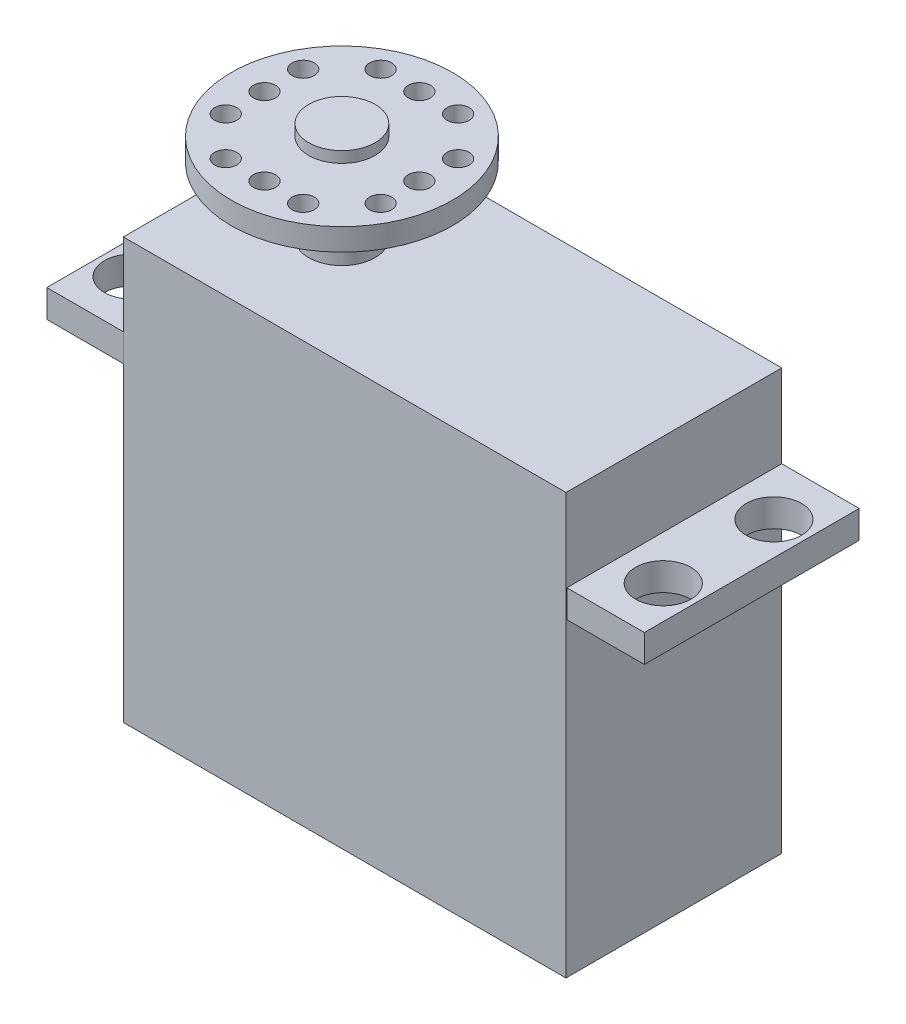
ISO-10303-21;
HEADER;
FILE_DESCRIPTION(('STEP AP214'),'2;1');
FILE_NAME('part.step','',(''),(''),'','','');
FILE_SCHEMA(('AUTOMOTIVE_DESIGN { 1 0 10303 214 1 1 1 1 }'));
ENDSEC;
DATA;
#1=APPLICATION_CONTEXT('core data for automotive mechanical design processes');
#2=APPLICATION_PROTOCOL_DEFINITION('international standard','automotive_design',2000,#1);
#3=PRODUCT_CONTEXT('',#1,'mechanical');
#4=PRODUCT('Part','Part','',(#3));
#5=PRODUCT_RELATED_PRODUCT_CATEGORY('part','',(#4));
#6=PRODUCT_DEFINITION_FORMATION('','',#4);
#7=PRODUCT_DEFINITION_CONTEXT('part definition',#1,'design');
#8=PRODUCT_DEFINITION('design','',#6,#7);
#9=PRODUCT_DEFINITION_SHAPE('','',#8);
#10=(LENGTH_UNIT() NAMED_UNIT(*) SI_UNIT(.MILLI.,.METRE.));
#11=(NAMED_UNIT(*) PLANE_ANGLE_UNIT() SI_UNIT($,.RADIAN.));
#12=(NAMED_UNIT(*) SI_UNIT($,.STERADIAN.) SOLID_ANGLE_UNIT());
#13=UNCERTAINTY_MEASURE_WITH_UNIT(LENGTH_MEASURE(1.E-05),#10,'distance_accuracy_value','');
#14=(GEOMETRIC_REPRESENTATION_CONTEXT(3) GLOBAL_UNCERTAINTY_ASSIGNED_CONTEXT((#13)) GLOBAL_UNIT_ASSIGNED_CONTEXT((#10,
#11,#12)) REPRESENTATION_CONTEXT('',''));
#15=CARTESIAN_POINT('',(0.,0.,0.));
#16=DIRECTION('',(0.,0.,1.));
#17=DIRECTION('',(1.,0.,0.));
#18=AXIS2_PLACEMENT_3D('',#15,#16,#17);
#19=CARTESIAN_POINT('',(0.,0.,19.5));
#20=DIRECTION('',(1.,0.,0.));
#21=DIRECTION('',(0.,0.,-1.));
#22=AXIS2_PLACEMENT_3D('',#19,#20,#21);
#23=PLANE('',#22);
#24=DIRECTION('',(0.,-1.,0.));
#25=VECTOR('',#24,1.);
#26=CARTESIAN_POINT('',(0.,30.5,19.4196359568841));
#27=LINE('',#26,#25);
#28=CARTESIAN_POINT('',(0.,30.5,19.4196359568841));
#29=VERTEX_POINT('',#28);
#30=CARTESIAN_POINT('',(0.,28.,19.4196359568841));
#31=VERTEX_POINT('',#30);
#32=EDGE_CURVE('E154',#29,#31,#27,.T.);
#33=ORIENTED_EDGE('',*,*,#32,.T.);
#34=DIRECTION('',(0.,0.,-1.));
#35=VECTOR('',#34,1.);
#36=CARTESIAN_POINT('',(0.,28.,0.));
#37=LINE('',#36,#35);
#38=CARTESIAN_POINT('',(0.,28.,0.));
#39=VERTEX_POINT('',#38);
#40=EDGE_CURVE('E49',#31,#39,#37,.T.);
#41=ORIENTED_EDGE('',*,*,#40,.T.);
#42=DIRECTION('',(0.,-1.,0.));
#43=VECTOR('',#42,1.);
#44=CARTESIAN_POINT('',(0.,0.,0.));
#45=LINE('',#44,#43);
#46=CARTESIAN_POINT('',(0.,0.,0.));
#47=VERTEX_POINT('',#46);
#48=EDGE_CURVE('E193',#39,#47,#45,.T.);
#49=ORIENTED_EDGE('',*,*,#48,.T.);
#50=DIRECTION('',(0.,0.,-1.));
#51=VECTOR('',#50,1.);
#52=CARTESIAN_POINT('',(0.,0.,19.5));
#53=LINE('',#52,#51);
#54=CARTESIAN_POINT('',(0.,0.,19.5));
#55=VERTEX_POINT('',#54);
#56=EDGE_CURVE('E42',#55,#47,#53,.T.);
#57=ORIENTED_EDGE('',*,*,#56,.F.);
#58=DIRECTION('',(0.,-1.,0.));
#59=VECTOR('',#58,1.);
#60=CARTESIAN_POINT('',(0.,0.,19.5));
#61=LINE('',#60,#59);
#62=CARTESIAN_POINT('',(0.,38.,19.5));
#63=VERTEX_POINT('',#62);
#64=EDGE_CURVE('E194',#63,#55,#61,.T.);
#65=ORIENTED_EDGE('',*,*,#64,.F.);
#66=DIRECTION('',(0.,0.,-1.));
#67=VECTOR('',#66,1.);
#68=CARTESIAN_POINT('',(0.,38.,19.5));
#69=LINE('',#68,#67);
#70=CARTESIAN_POINT('',(0.,38.,0.));
#71=VERTEX_POINT('',#70);
#72=EDGE_CURVE('E204',#63,#71,#69,.T.);
#73=ORIENTED_EDGE('',*,*,#72,.T.);
#74=CARTESIAN_POINT('',(0.,30.5,0.));
#75=VERTEX_POINT('',#74);
#76=EDGE_CURVE('E205',#71,#75,#45,.T.);
#77=ORIENTED_EDGE('',*,*,#76,.T.);
#78=DIRECTION('',(0.,0.,-1.));
#79=VECTOR('',#78,1.);
#80=CARTESIAN_POINT('',(0.,30.5,0.));
#81=LINE('',#80,#79);
#82=EDGE_CURVE('E141',#29,#75,#81,.T.);
#83=ORIENTED_EDGE('',*,*,#82,.F.);
#84=EDGE_LOOP('',(#33,#41,#49,#57,#65,#73,#77,#83));
#85=FACE_BOUND('',#84,.T.);
#86=ADVANCED_FACE('F35',(#85),#23,.F.);
#87=CARTESIAN_POINT('',(0.,0.,19.5));
#88=DIRECTION('',(0.,1.,0.));
#89=DIRECTION('',(0.,0.,1.));
#90=AXIS2_PLACEMENT_3D('',#87,#88,#89);
#91=PLANE('',#90);
#92=DIRECTION('',(1.,0.,0.));
#93=VECTOR('',#92,1.);
#94=CARTESIAN_POINT('',(0.,0.,0.));
#95=LINE('',#94,#93);
#96=CARTESIAN_POINT('',(40.,0.,0.));
#97=VERTEX_POINT('',#96);
#98=EDGE_CURVE('E207',#47,#97,#95,.T.);
#99=ORIENTED_EDGE('',*,*,#98,.T.);
#100=DIRECTION('',(0.,0.,-1.));
#101=VECTOR('',#100,1.);
#102=CARTESIAN_POINT('',(40.,0.,19.5));
#103=LINE('',#102,#101);
#104=CARTESIAN_POINT('',(40.,0.,19.5));
#105=VERTEX_POINT('',#104);
#106=EDGE_CURVE('E218',#105,#97,#103,.T.);
#107=ORIENTED_EDGE('',*,*,#106,.F.);
#108=DIRECTION('',(1.,0.,0.));
#109=VECTOR('',#108,1.);
#110=CARTESIAN_POINT('',(0.,0.,19.5));
#111=LINE('',#110,#109);
#112=EDGE_CURVE('E197',#55,#105,#111,.T.);
#113=ORIENTED_EDGE('',*,*,#112,.F.);
#114=ORIENTED_EDGE('',*,*,#56,.T.);
#115=EDGE_LOOP('',(#99,#107,#113,#114));
#116=FACE_BOUND('',#115,.T.);
#117=ADVANCED_FACE('F223',(#116),#91,.F.);
#118=CARTESIAN_POINT('',(40.,0.,19.5));
#119=DIRECTION('',(-1.,0.,0.));
#120=DIRECTION('',(0.,0.,1.));
#121=AXIS2_PLACEMENT_3D('',#118,#119,#120);
#122=PLANE('',#121);
#123=DIRECTION('',(0.,1.,0.));
#124=VECTOR('',#123,1.);
#125=CARTESIAN_POINT('',(40.,0.,0.));
#126=LINE('',#125,#124);
#127=CARTESIAN_POINT('',(40.,28.,0.));
#128=VERTEX_POINT('',#127);
#129=EDGE_CURVE('E210',#97,#128,#126,.T.);
#130=ORIENTED_EDGE('',*,*,#129,.T.);
#131=DIRECTION('',(0.,0.,1.));
#132=VECTOR('',#131,1.);
#133=CARTESIAN_POINT('',(40.,28.,0.));
#134=LINE('',#133,#132);
#135=CARTESIAN_POINT('',(40.,28.,19.4196359568841));
#136=VERTEX_POINT('',#135);
#137=EDGE_CURVE('E57',#128,#136,#134,.T.);
#138=ORIENTED_EDGE('',*,*,#137,.T.);
#139=DIRECTION('',(0.,-1.,0.));
#140=VECTOR('',#139,1.);
#141=CARTESIAN_POINT('',(40.,30.5,19.4196359568841));
#142=LINE('',#141,#140);
#143=CARTESIAN_POINT('',(40.,30.5,19.4196359568841));
#144=VERTEX_POINT('',#143);
#145=EDGE_CURVE('E190',#144,#136,#142,.T.);
#146=ORIENTED_EDGE('',*,*,#145,.F.);
#147=DIRECTION('',(0.,0.,1.));
#148=VECTOR('',#147,1.);
#149=CARTESIAN_POINT('',(40.,30.5,0.));
#150=LINE('',#149,#148);
#151=CARTESIAN_POINT('',(40.,30.5,0.));
#152=VERTEX_POINT('',#151);
#153=EDGE_CURVE('E166',#152,#144,#150,.T.);
#154=ORIENTED_EDGE('',*,*,#153,.F.);
#155=CARTESIAN_POINT('',(40.,38.,0.));
#156=VERTEX_POINT('',#155);
#157=EDGE_CURVE('E209',#152,#156,#126,.T.);
#158=ORIENTED_EDGE('',*,*,#157,.T.);
#159=DIRECTION('',(0.,0.,-1.));
#160=VECTOR('',#159,1.);
#161=CARTESIAN_POINT('',(40.,38.,19.5));
#162=LINE('',#161,#160);
#163=CARTESIAN_POINT('',(40.,38.,19.5));
#164=VERTEX_POINT('',#163);
#165=EDGE_CURVE('E215',#164,#156,#162,.T.);
#166=ORIENTED_EDGE('',*,*,#165,.F.);
#167=DIRECTION('',(0.,1.,0.));
#168=VECTOR('',#167,1.);
#169=CARTESIAN_POINT('',(40.,0.,19.5));
#170=LINE('',#169,#168);
#171=EDGE_CURVE('E200',#105,#164,#170,.T.);
#172=ORIENTED_EDGE('',*,*,#171,.F.);
#173=ORIENTED_EDGE('',*,*,#106,.T.);
#174=EDGE_LOOP('',(#130,#138,#146,#154,#158,#166,#172,#173));
#175=FACE_BOUND('',#174,.T.);
#176=ADVANCED_FACE('F231',(#175),#122,.F.);
#177=CARTESIAN_POINT('',(0.,38.,19.5));
#178=DIRECTION('',(0.,-1.,0.));
#179=DIRECTION('',(0.,0.,-1.));
#180=AXIS2_PLACEMENT_3D('',#177,#178,#179);
#181=PLANE('',#180);
#182=CARTESIAN_POINT('',(10.,38.,9.75));
#183=DIRECTION('',(0.,-1.,0.));
#184=DIRECTION('',(0.,0.,-1.));
#185=AXIS2_PLACEMENT_3D('',#182,#183,#184);
#186=CIRCLE('',#185,3.);
#187=CARTESIAN_POINT('',(10.,38.,6.75));
#188=VERTEX_POINT('',#187);
#189=EDGE_CURVE('E11',#188,#188,#186,.F.);
#190=ORIENTED_EDGE('',*,*,#189,.F.);
#191=EDGE_LOOP('',(#190));
#192=FACE_BOUND('',#191,.T.);
#193=DIRECTION('',(-1.,0.,0.));
#194=VECTOR('',#193,1.);
#195=CARTESIAN_POINT('',(0.,38.,0.));
#196=LINE('',#195,#194);
#197=EDGE_CURVE('E198',#156,#71,#196,.T.);
#198=ORIENTED_EDGE('',*,*,#197,.T.);
#199=ORIENTED_EDGE('',*,*,#72,.F.);
#200=DIRECTION('',(-1.,0.,0.));
#201=VECTOR('',#200,1.);
#202=CARTESIAN_POINT('',(0.,38.,19.5));
#203=LINE('',#202,#201);
#204=EDGE_CURVE('E202',#164,#63,#203,.T.);
#205=ORIENTED_EDGE('',*,*,#204,.F.);
#206=ORIENTED_EDGE('',*,*,#165,.T.);
#207=EDGE_LOOP('',(#198,#199,#205,#206));
#208=FACE_BOUND('',#207,.T.);
#209=ADVANCED_FACE('F239',(#192,#208),#181,.F.);
#210=CARTESIAN_POINT('',(0.,0.,19.5));
#211=DIRECTION('',(0.,0.,-1.));
#212=DIRECTION('',(-1.,0.,0.));
#213=AXIS2_PLACEMENT_3D('',#210,#211,#212);
#214=PLANE('',#213);
#215=ORIENTED_EDGE('',*,*,#64,.T.);
#216=ORIENTED_EDGE('',*,*,#112,.T.);
#217=ORIENTED_EDGE('',*,*,#171,.T.);
#218=ORIENTED_EDGE('',*,*,#204,.T.);
#219=EDGE_LOOP('',(#215,#216,#217,#218));
#220=FACE_BOUND('',#219,.T.);
#221=ADVANCED_FACE('F236',(#220),#214,.F.);
#222=CARTESIAN_POINT('',(0.,0.,0.));
#223=DIRECTION('',(0.,0.,-1.));
#224=DIRECTION('',(-1.,0.,0.));
#225=AXIS2_PLACEMENT_3D('',#222,#223,#224);
#226=PLANE('',#225);
#227=ORIENTED_EDGE('',*,*,#76,.F.);
#228=ORIENTED_EDGE('',*,*,#197,.F.);
#229=ORIENTED_EDGE('',*,*,#157,.F.);
#230=DIRECTION('',(-1.,0.,0.));
#231=VECTOR('',#230,1.);
#232=CARTESIAN_POINT('',(40.,30.5,0.));
#233=LINE('',#232,#231);
#234=CARTESIAN_POINT('',(47.,30.5,0.));
#235=VERTEX_POINT('',#234);
#236=EDGE_CURVE('E174',#235,#152,#233,.T.);
#237=ORIENTED_EDGE('',*,*,#236,.F.);
#238=DIRECTION('',(0.,-1.,0.));
#239=VECTOR('',#238,1.);
#240=CARTESIAN_POINT('',(47.,30.5,0.));
#241=LINE('',#240,#239);
#242=CARTESIAN_POINT('',(47.,28.,0.));
#243=VERTEX_POINT('',#242);
#244=EDGE_CURVE('E177',#235,#243,#241,.T.);
#245=ORIENTED_EDGE('',*,*,#244,.T.);
#246=DIRECTION('',(-1.,0.,0.));
#247=VECTOR('',#246,1.);
#248=CARTESIAN_POINT('',(40.,28.,0.));
#249=LINE('',#248,#247);
#250=EDGE_CURVE('E170',#243,#128,#249,.T.);
#251=ORIENTED_EDGE('',*,*,#250,.T.);
#252=ORIENTED_EDGE('',*,*,#129,.F.);
#253=ORIENTED_EDGE('',*,*,#98,.F.);
#254=ORIENTED_EDGE('',*,*,#48,.F.);
#255=DIRECTION('',(-1.,0.,0.));
#256=VECTOR('',#255,1.);
#257=CARTESIAN_POINT('',(0.,28.,0.));
#258=LINE('',#257,#256);
#259=CARTESIAN_POINT('',(-7.,28.,0.));
#260=VERTEX_POINT('',#259);
#261=EDGE_CURVE('E148',#39,#260,#258,.T.);
#262=ORIENTED_EDGE('',*,*,#261,.T.);
#263=DIRECTION('',(0.,-1.,0.));
#264=VECTOR('',#263,1.);
#265=CARTESIAN_POINT('',(-7.,30.5,0.));
#266=LINE('',#265,#264);
#267=CARTESIAN_POINT('',(-7.,30.5,0.));
#268=VERTEX_POINT('',#267);
#269=EDGE_CURVE('E128',#268,#260,#266,.T.);
#270=ORIENTED_EDGE('',*,*,#269,.F.);
#271=DIRECTION('',(-1.,0.,0.));
#272=VECTOR('',#271,1.);
#273=CARTESIAN_POINT('',(0.,30.5,0.));
#274=LINE('',#273,#272);
#275=EDGE_CURVE('E135',#75,#268,#274,.T.);
#276=ORIENTED_EDGE('',*,*,#275,.F.);
#277=EDGE_LOOP('',(#227,#228,#229,#237,#245,#251,#252,#253,#254,#262,#270,#276));
#278=FACE_BOUND('',#277,.T.);
#279=ADVANCED_FACE('F146',(#278),#226,.T.);
#280=CARTESIAN_POINT('',(0.,30.5,0.));
#281=DIRECTION('',(0.,1.,0.));
#282=DIRECTION('',(0.,0.,1.));
#283=AXIS2_PLACEMENT_3D('',#280,#281,#282);
#284=PLANE('',#283);
#285=CARTESIAN_POINT('',(44.,30.5,4.70981797844207));
#286=DIRECTION('',(0.,1.,0.));
#287=DIRECTION('',(0.,0.,1.));
#288=AXIS2_PLACEMENT_3D('',#285,#286,#287);
#289=CIRCLE('',#288,2.5);
#290=CARTESIAN_POINT('',(44.,30.5,7.20981797844208));
#291=VERTEX_POINT('',#290);
#292=EDGE_CURVE('E161',#291,#291,#289,.T.);
#293=ORIENTED_EDGE('',*,*,#292,.F.);
#294=EDGE_LOOP('',(#293));
#295=FACE_BOUND('',#294,.T.);
#296=ORIENTED_EDGE('',*,*,#153,.T.);
#297=DIRECTION('',(1.,0.,0.));
#298=VECTOR('',#297,1.);
#299=CARTESIAN_POINT('',(40.,30.5,19.4196359568841));
#300=LINE('',#299,#298);
#301=CARTESIAN_POINT('',(47.,30.5,19.4196359568841));
#302=VERTEX_POINT('',#301);
#303=EDGE_CURVE('E169',#144,#302,#300,.T.);
#304=ORIENTED_EDGE('',*,*,#303,.T.);
#305=DIRECTION('',(0.,0.,-1.));
#306=VECTOR('',#305,1.);
#307=CARTESIAN_POINT('',(47.,30.5,0.));
#308=LINE('',#307,#306);
#309=EDGE_CURVE('E172',#302,#235,#308,.T.);
#310=ORIENTED_EDGE('',*,*,#309,.T.);
#311=ORIENTED_EDGE('',*,*,#236,.T.);
#312=EDGE_LOOP('',(#296,#304,#310,#311));
#313=FACE_BOUND('',#312,.T.);
#314=CARTESIAN_POINT('',(44.,30.5,14.7098179784421));
#315=DIRECTION('',(0.,1.,0.));
#316=DIRECTION('',(0.,0.,-1.));
#317=AXIS2_PLACEMENT_3D('',#314,#315,#316);
#318=CIRCLE('',#317,2.5);
#319=CARTESIAN_POINT('',(44.,30.5,12.2098179784421));
#320=VERTEX_POINT('',#319);
#321=EDGE_CURVE('E152',#320,#320,#318,.T.);
#322=ORIENTED_EDGE('',*,*,#321,.F.);
#323=EDGE_LOOP('',(#322));
#324=FACE_BOUND('',#323,.T.);
#325=ADVANCED_FACE('F244',(#295,#313,#324),#284,.T.);
#326=CARTESIAN_POINT('',(0.,28.,0.));
#327=DIRECTION('',(0.,1.,0.));
#328=DIRECTION('',(0.,0.,1.));
#329=AXIS2_PLACEMENT_3D('',#326,#327,#328);
#330=PLANE('',#329);
#331=ORIENTED_EDGE('',*,*,#137,.F.);
#332=ORIENTED_EDGE('',*,*,#250,.F.);
#333=DIRECTION('',(0.,0.,-1.));
#334=VECTOR('',#333,1.);
#335=CARTESIAN_POINT('',(47.,28.,0.));
#336=LINE('',#335,#334);
#337=CARTESIAN_POINT('',(47.,28.,19.4196359568841));
#338=VERTEX_POINT('',#337);
#339=EDGE_CURVE('E181',#338,#243,#336,.T.);
#340=ORIENTED_EDGE('',*,*,#339,.F.);
#341=DIRECTION('',(1.,0.,0.));
#342=VECTOR('',#341,1.);
#343=CARTESIAN_POINT('',(40.,28.,19.4196359568841));
#344=LINE('',#343,#342);
#345=EDGE_CURVE('E179',#136,#338,#344,.T.);
#346=ORIENTED_EDGE('',*,*,#345,.F.);
#347=EDGE_LOOP('',(#331,#332,#340,#346));
#348=FACE_BOUND('',#347,.T.);
#349=CARTESIAN_POINT('',(44.,28.,4.70981797844207));
#350=DIRECTION('',(0.,1.,0.));
#351=DIRECTION('',(0.,0.,1.));
#352=AXIS2_PLACEMENT_3D('',#349,#350,#351);
#353=CIRCLE('',#352,2.5);
#354=CARTESIAN_POINT('',(44.,28.,7.20981797844208));
#355=VERTEX_POINT('',#354);
#356=EDGE_CURVE('E159',#355,#355,#353,.T.);
#357=ORIENTED_EDGE('',*,*,#356,.T.);
#358=EDGE_LOOP('',(#357));
#359=FACE_BOUND('',#358,.T.);
#360=CARTESIAN_POINT('',(44.,28.,14.7098179784421));
#361=DIRECTION('',(0.,1.,0.));
#362=DIRECTION('',(0.,0.,-1.));
#363=AXIS2_PLACEMENT_3D('',#360,#361,#362);
#364=CIRCLE('',#363,2.5);
#365=CARTESIAN_POINT('',(44.,28.,12.2098179784421));
#366=VERTEX_POINT('',#365);
#367=EDGE_CURVE('E149',#366,#366,#364,.T.);
#368=ORIENTED_EDGE('',*,*,#367,.T.);
#369=EDGE_LOOP('',(#368));
#370=FACE_BOUND('',#369,.T.);
#371=ADVANCED_FACE('F254',(#348,#359,#370),#330,.F.);
#372=CARTESIAN_POINT('',(40.,30.5,19.4196359568841));
#373=DIRECTION('',(0.,0.,-1.));
#374=DIRECTION('',(-1.,0.,0.));
#375=AXIS2_PLACEMENT_3D('',#372,#373,#374);
#376=PLANE('',#375);
#377=ORIENTED_EDGE('',*,*,#345,.T.);
#378=DIRECTION('',(0.,-1.,0.));
#379=VECTOR('',#378,1.);
#380=CARTESIAN_POINT('',(47.,30.5,19.4196359568841));
#381=LINE('',#380,#379);
#382=EDGE_CURVE('E187',#302,#338,#381,.T.);
#383=ORIENTED_EDGE('',*,*,#382,.F.);
#384=ORIENTED_EDGE('',*,*,#303,.F.);
#385=ORIENTED_EDGE('',*,*,#145,.T.);
#386=EDGE_LOOP('',(#377,#383,#384,#385));
#387=FACE_BOUND('',#386,.T.);
#388=ADVANCED_FACE('F257',(#387),#376,.F.);
#389=CARTESIAN_POINT('',(47.,30.5,0.));
#390=DIRECTION('',(-1.,0.,0.));
#391=DIRECTION('',(0.,0.,1.));
#392=AXIS2_PLACEMENT_3D('',#389,#390,#391);
#393=PLANE('',#392);
#394=ORIENTED_EDGE('',*,*,#339,.T.);
#395=ORIENTED_EDGE('',*,*,#244,.F.);
#396=ORIENTED_EDGE('',*,*,#309,.F.);
#397=ORIENTED_EDGE('',*,*,#382,.T.);
#398=EDGE_LOOP('',(#394,#395,#396,#397));
#399=FACE_BOUND('',#398,.T.);
#400=ADVANCED_FACE('F251',(#399),#393,.F.);
#401=CARTESIAN_POINT('',(44.,30.5,4.70981797844207));
#402=DIRECTION('',(0.,-1.,0.));
#403=DIRECTION('',(0.,0.,-1.));
#404=AXIS2_PLACEMENT_3D('',#401,#402,#403);
#405=CYLINDRICAL_SURFACE('',#404,2.5);
#406=ORIENTED_EDGE('',*,*,#292,.T.);
#407=EDGE_LOOP('',(#406));
#408=FACE_BOUND('',#407,.T.);
#409=ORIENTED_EDGE('',*,*,#356,.F.);
#410=EDGE_LOOP('',(#409));
#411=FACE_BOUND('',#410,.T.);
#412=ADVANCED_FACE('F264',(#408,#411),#405,.F.);
#413=CARTESIAN_POINT('',(44.,30.5,14.7098179784421));
#414=DIRECTION('',(0.,-1.,0.));
#415=DIRECTION('',(0.,0.,-1.));
#416=AXIS2_PLACEMENT_3D('',#413,#414,#415);
#417=CYLINDRICAL_SURFACE('',#416,2.5);
#418=ORIENTED_EDGE('',*,*,#321,.T.);
#419=EDGE_LOOP('',(#418));
#420=FACE_BOUND('',#419,.T.);
#421=ORIENTED_EDGE('',*,*,#367,.F.);
#422=EDGE_LOOP('',(#421));
#423=FACE_BOUND('',#422,.T.);
#424=ADVANCED_FACE('F321',(#420,#423),#417,.F.);
#425=CARTESIAN_POINT('',(0.,30.5,0.));
#426=DIRECTION('',(0.,1.,0.));
#427=DIRECTION('',(0.,0.,1.));
#428=AXIS2_PLACEMENT_3D('',#425,#426,#427);
#429=PLANE('',#428);
#430=CARTESIAN_POINT('',(-4.,30.5,14.7098179784421));
#431=DIRECTION('',(0.,1.,0.));
#432=DIRECTION('',(0.,0.,1.));
#433=AXIS2_PLACEMENT_3D('',#430,#431,#432);
#434=CIRCLE('',#433,2.5);
#435=CARTESIAN_POINT('',(-4.,30.5,17.2098179784421));
#436=VERTEX_POINT('',#435);
#437=EDGE_CURVE('E672',#436,#436,#434,.T.);
#438=ORIENTED_EDGE('',*,*,#437,.F.);
#439=EDGE_LOOP('',(#438));
#440=FACE_BOUND('',#439,.T.);
#441=ORIENTED_EDGE('',*,*,#275,.T.);
#442=DIRECTION('',(0.,0.,1.));
#443=VECTOR('',#442,1.);
#444=CARTESIAN_POINT('',(-7.,30.5,0.));
#445=LINE('',#444,#443);
#446=CARTESIAN_POINT('',(-7.,30.5,19.4196359568841));
#447=VERTEX_POINT('',#446);
#448=EDGE_CURVE('E124',#268,#447,#445,.T.);
#449=ORIENTED_EDGE('',*,*,#448,.T.);
#450=DIRECTION('',(1.,0.,0.));
#451=VECTOR('',#450,1.);
#452=CARTESIAN_POINT('',(0.,30.5,19.4196359568841));
#453=LINE('',#452,#451);
#454=EDGE_CURVE('E134',#447,#29,#453,.T.);
#455=ORIENTED_EDGE('',*,*,#454,.T.);
#456=ORIENTED_EDGE('',*,*,#82,.T.);
#457=EDGE_LOOP('',(#441,#449,#455,#456));
#458=FACE_BOUND('',#457,.T.);
#459=CARTESIAN_POINT('',(-4.,30.5,4.70981797844207));
#460=DIRECTION('',(0.,1.,0.));
#461=DIRECTION('',(0.,0.,-1.));
#462=AXIS2_PLACEMENT_3D('',#459,#460,#461);
#463=CIRCLE('',#462,2.5);
#464=CARTESIAN_POINT('',(-4.,30.5,2.20981797844207));
#465=VERTEX_POINT('',#464);
#466=EDGE_CURVE('E666',#465,#465,#463,.T.);
#467=ORIENTED_EDGE('',*,*,#466,.F.);
#468=EDGE_LOOP('',(#467));
#469=FACE_BOUND('',#468,.T.);
#470=ADVANCED_FACE('F138',(#440,#458,#469),#429,.T.);
#471=CARTESIAN_POINT('',(0.,28.,0.));
#472=DIRECTION('',(0.,1.,0.));
#473=DIRECTION('',(0.,0.,1.));
#474=AXIS2_PLACEMENT_3D('',#471,#472,#473);
#475=PLANE('',#474);
#476=ORIENTED_EDGE('',*,*,#261,.F.);
#477=ORIENTED_EDGE('',*,*,#40,.F.);
#478=DIRECTION('',(1.,0.,0.));
#479=VECTOR('',#478,1.);
#480=CARTESIAN_POINT('',(0.,28.,19.4196359568841));
#481=LINE('',#480,#479);
#482=CARTESIAN_POINT('',(-7.,28.,19.4196359568841));
#483=VERTEX_POINT('',#482);
#484=EDGE_CURVE('E682',#483,#31,#481,.T.);
#485=ORIENTED_EDGE('',*,*,#484,.F.);
#486=DIRECTION('',(0.,0.,1.));
#487=VECTOR('',#486,1.);
#488=CARTESIAN_POINT('',(-7.,28.,0.));
#489=LINE('',#488,#487);
#490=EDGE_CURVE('E680',#260,#483,#489,.T.);
#491=ORIENTED_EDGE('',*,*,#490,.F.);
#492=EDGE_LOOP('',(#476,#477,#485,#491));
#493=FACE_BOUND('',#492,.T.);
#494=CARTESIAN_POINT('',(-4.,28.,14.7098179784421));
#495=DIRECTION('',(0.,1.,0.));
#496=DIRECTION('',(0.,0.,1.));
#497=AXIS2_PLACEMENT_3D('',#494,#495,#496);
#498=CIRCLE('',#497,2.5);
#499=CARTESIAN_POINT('',(-4.,28.,17.2098179784421));
#500=VERTEX_POINT('',#499);
#501=EDGE_CURVE('E669',#500,#500,#498,.T.);
#502=ORIENTED_EDGE('',*,*,#501,.T.);
#503=EDGE_LOOP('',(#502));
#504=FACE_BOUND('',#503,.T.);
#505=CARTESIAN_POINT('',(-4.,28.,4.70981797844207));
#506=DIRECTION('',(0.,1.,0.));
#507=DIRECTION('',(0.,0.,-1.));
#508=AXIS2_PLACEMENT_3D('',#505,#506,#507);
#509=CIRCLE('',#508,2.5);
#510=CARTESIAN_POINT('',(-4.,28.,2.20981797844207));
#511=VERTEX_POINT('',#510);
#512=EDGE_CURVE('E665',#511,#511,#509,.T.);
#513=ORIENTED_EDGE('',*,*,#512,.T.);
#514=EDGE_LOOP('',(#513));
#515=FACE_BOUND('',#514,.T.);
#516=ADVANCED_FACE('F340',(#493,#504,#515),#475,.F.);
#517=CARTESIAN_POINT('',(-7.,30.5,0.));
#518=DIRECTION('',(1.,0.,0.));
#519=DIRECTION('',(0.,0.,-1.));
#520=AXIS2_PLACEMENT_3D('',#517,#518,#519);
#521=PLANE('',#520);
#522=ORIENTED_EDGE('',*,*,#490,.T.);
#523=DIRECTION('',(0.,-1.,0.));
#524=VECTOR('',#523,1.);
#525=CARTESIAN_POINT('',(-7.,30.5,19.4196359568841));
#526=LINE('',#525,#524);
#527=EDGE_CURVE('E131',#447,#483,#526,.T.);
#528=ORIENTED_EDGE('',*,*,#527,.F.);
#529=ORIENTED_EDGE('',*,*,#448,.F.);
#530=ORIENTED_EDGE('',*,*,#269,.T.);
#531=EDGE_LOOP('',(#522,#528,#529,#530));
#532=FACE_BOUND('',#531,.T.);
#533=ADVANCED_FACE('F126',(#532),#521,.F.);
#534=CARTESIAN_POINT('',(0.,30.5,19.4196359568841));
#535=DIRECTION('',(0.,0.,-1.));
#536=DIRECTION('',(-1.,0.,0.));
#537=AXIS2_PLACEMENT_3D('',#534,#535,#536);
#538=PLANE('',#537);
#539=ORIENTED_EDGE('',*,*,#484,.T.);
#540=ORIENTED_EDGE('',*,*,#32,.F.);
#541=ORIENTED_EDGE('',*,*,#454,.F.);
#542=ORIENTED_EDGE('',*,*,#527,.T.);
#543=EDGE_LOOP('',(#539,#540,#541,#542));
#544=FACE_BOUND('',#543,.T.);
#545=ADVANCED_FACE('F358',(#544),#538,.F.);
#546=CARTESIAN_POINT('',(-4.,30.5,14.7098179784421));
#547=DIRECTION('',(0.,-1.,0.));
#548=DIRECTION('',(0.,0.,-1.));
#549=AXIS2_PLACEMENT_3D('',#546,#547,#548);
#550=CYLINDRICAL_SURFACE('',#549,2.5);
#551=ORIENTED_EDGE('',*,*,#437,.T.);
#552=EDGE_LOOP('',(#551));
#553=FACE_BOUND('',#552,.T.);
#554=ORIENTED_EDGE('',*,*,#501,.F.);
#555=EDGE_LOOP('',(#554));
#556=FACE_BOUND('',#555,.T.);
#557=ADVANCED_FACE('F367',(#553,#556),#550,.F.);
#558=CARTESIAN_POINT('',(-4.,30.5,4.70981797844207));
#559=DIRECTION('',(0.,-1.,0.));
#560=DIRECTION('',(0.,0.,-1.));
#561=AXIS2_PLACEMENT_3D('',#558,#559,#560);
#562=CYLINDRICAL_SURFACE('',#561,2.5);
#563=ORIENTED_EDGE('',*,*,#466,.T.);
#564=EDGE_LOOP('',(#563));
#565=FACE_BOUND('',#564,.T.);
#566=ORIENTED_EDGE('',*,*,#512,.F.);
#567=EDGE_LOOP('',(#566));
#568=FACE_BOUND('',#567,.T.);
#569=ADVANCED_FACE('F377',(#565,#568),#562,.F.);
#570=CARTESIAN_POINT('',(10.,44.,9.75));
#571=DIRECTION('',(0.,-1.,0.));
#572=DIRECTION('',(0.,0.,-1.));
#573=AXIS2_PLACEMENT_3D('',#570,#571,#572);
#574=CYLINDRICAL_SURFACE('',#573,3.);
#575=CARTESIAN_POINT('',(10.,44.,9.75));
#576=DIRECTION('',(0.,1.,0.));
#577=DIRECTION('',(0.,0.,1.));
#578=AXIS2_PLACEMENT_3D('',#575,#576,#577);
#579=CIRCLE('',#578,3.);
#580=CARTESIAN_POINT('',(10.,44.,12.75));
#581=VERTEX_POINT('',#580);
#582=EDGE_CURVE('E660',#581,#581,#579,.T.);
#583=ORIENTED_EDGE('',*,*,#582,.F.);
#584=EDGE_LOOP('',(#583));
#585=FACE_BOUND('',#584,.T.);
#586=ORIENTED_EDGE('',*,*,#189,.T.);
#587=EDGE_LOOP('',(#586));
#588=FACE_BOUND('',#587,.T.);
#589=ADVANCED_FACE('F386',(#585,#588),#574,.T.);
#590=CARTESIAN_POINT('',(10.,46.,9.75));
#591=DIRECTION('',(0.,1.,0.));
#592=DIRECTION('',(0.,0.,1.));
#593=AXIS2_PLACEMENT_3D('',#590,#591,#592);
#594=PLANE('',#593);
#595=CARTESIAN_POINT('',(10.,46.,9.75));
#596=DIRECTION('',(0.,1.,0.));
#597=DIRECTION('',(0.,0.,1.));
#598=AXIS2_PLACEMENT_3D('',#595,#596,#597);
#599=CIRCLE('',#598,3.);
#600=CARTESIAN_POINT('',(10.,46.,12.75));
#601=VERTEX_POINT('',#600);
#602=EDGE_CURVE('E580',#601,#601,#599,.T.);
#603=ORIENTED_EDGE('',*,*,#602,.F.);
#604=EDGE_LOOP('',(#603));
#605=FACE_BOUND('',#604,.T.);
#606=CARTESIAN_POINT('',(17.,46.,9.75));
#607=DIRECTION('',(0.,1.,0.));
#608=DIRECTION('',(0.,0.,-1.));
#609=AXIS2_PLACEMENT_3D('',#606,#607,#608);
#610=CIRCLE('',#609,1.00000000000001);
#611=CARTESIAN_POINT('',(17.,46.,8.74999999999999));
#612=VERTEX_POINT('',#611);
#613=EDGE_CURVE('E591',#612,#612,#610,.T.);
#614=ORIENTED_EDGE('',*,*,#613,.F.);
#615=EDGE_LOOP('',(#614));
#616=FACE_BOUND('',#615,.T.);
#617=CARTESIAN_POINT('',(3.,46.,6.25));
#618=DIRECTION('',(0.,1.,0.));
#619=DIRECTION('',(0.,0.,1.));
#620=AXIS2_PLACEMENT_3D('',#617,#618,#619);
#621=CIRCLE('',#620,1.);
#622=CARTESIAN_POINT('',(3.,46.,7.25));
#623=VERTEX_POINT('',#622);
#624=EDGE_CURVE('E603',#623,#623,#621,.T.);
#625=ORIENTED_EDGE('',*,*,#624,.F.);
#626=EDGE_LOOP('',(#625));
#627=FACE_BOUND('',#626,.T.);
#628=CARTESIAN_POINT('',(3.,46.,13.25));
#629=DIRECTION('',(0.,1.,0.));
#630=DIRECTION('',(0.,0.,1.));
#631=AXIS2_PLACEMENT_3D('',#628,#629,#630);
#632=CIRCLE('',#631,1.);
#633=CARTESIAN_POINT('',(3.,46.,14.25));
#634=VERTEX_POINT('',#633);
#635=EDGE_CURVE('E615',#634,#634,#632,.T.);
#636=ORIENTED_EDGE('',*,*,#635,.F.);
#637=EDGE_LOOP('',(#636));
#638=FACE_BOUND('',#637,.T.);
#639=CARTESIAN_POINT('',(13.5,46.,16.75));
#640=DIRECTION('',(0.,1.,0.));
#641=DIRECTION('',(0.,0.,-1.));
#642=AXIS2_PLACEMENT_3D('',#639,#640,#641);
#643=CIRCLE('',#642,1.);
#644=CARTESIAN_POINT('',(13.5,46.,15.75));
#645=VERTEX_POINT('',#644);
#646=EDGE_CURVE('E627',#645,#645,#643,.T.);
#647=ORIENTED_EDGE('',*,*,#646,.F.);
#648=EDGE_LOOP('',(#647));
#649=FACE_BOUND('',#648,.T.);
#650=CARTESIAN_POINT('',(6.5,46.,2.75));
#651=DIRECTION('',(0.,1.,0.));
#652=DIRECTION('',(0.,0.,1.));
#653=AXIS2_PLACEMENT_3D('',#650,#651,#652);
#654=CIRCLE('',#653,1.);
#655=CARTESIAN_POINT('',(6.5,46.,3.75));
#656=VERTEX_POINT('',#655);
#657=EDGE_CURVE('E639',#656,#656,#654,.T.);
#658=ORIENTED_EDGE('',*,*,#657,.F.);
#659=EDGE_LOOP('',(#658));
#660=FACE_BOUND('',#659,.T.);
#661=CARTESIAN_POINT('',(10.,46.,2.75));
#662=DIRECTION('',(0.,1.,0.));
#663=DIRECTION('',(0.,0.,1.));
#664=AXIS2_PLACEMENT_3D('',#661,#662,#663);
#665=CIRCLE('',#664,1.);
#666=CARTESIAN_POINT('',(10.,46.,3.75));
#667=VERTEX_POINT('',#666);
#668=EDGE_CURVE('E651',#667,#667,#665,.T.);
#669=ORIENTED_EDGE('',*,*,#668,.F.);
#670=EDGE_LOOP('',(#669));
#671=FACE_BOUND('',#670,.T.);
#672=CARTESIAN_POINT('',(10.,46.,9.75));
#673=DIRECTION('',(0.,1.,0.));
#674=DIRECTION('',(0.,0.,1.));
#675=AXIS2_PLACEMENT_3D('',#672,#673,#674);
#676=CIRCLE('',#675,10.);
#677=CARTESIAN_POINT('',(10.,46.,19.75));
#678=VERTEX_POINT('',#677);
#679=EDGE_CURVE('E657',#678,#678,#676,.T.);
#680=ORIENTED_EDGE('',*,*,#679,.T.);
#681=EDGE_LOOP('',(#680));
#682=FACE_BOUND('',#681,.T.);
#683=CARTESIAN_POINT('',(13.5,46.,2.75));
#684=DIRECTION('',(0.,1.,0.));
#685=DIRECTION('',(0.,0.,1.));
#686=AXIS2_PLACEMENT_3D('',#683,#684,#685);
#687=CIRCLE('',#686,1.);
#688=CARTESIAN_POINT('',(13.5,46.,3.75));
#689=VERTEX_POINT('',#688);
#690=EDGE_CURVE('E645',#689,#689,#687,.T.);
#691=ORIENTED_EDGE('',*,*,#690,.F.);
#692=EDGE_LOOP('',(#691));
#693=FACE_BOUND('',#692,.T.);
#694=CARTESIAN_POINT('',(6.5,46.,16.75));
#695=DIRECTION('',(0.,1.,0.));
#696=DIRECTION('',(0.,0.,-1.));
#697=AXIS2_PLACEMENT_3D('',#694,#695,#696);
#698=CIRCLE('',#697,1.);
#699=CARTESIAN_POINT('',(6.5,46.,15.75));
#700=VERTEX_POINT('',#699);
#701=EDGE_CURVE('E633',#700,#700,#698,.T.);
#702=ORIENTED_EDGE('',*,*,#701,.F.);
#703=EDGE_LOOP('',(#702));
#704=FACE_BOUND('',#703,.T.);
#705=CARTESIAN_POINT('',(10.,46.,16.75));
#706=DIRECTION('',(0.,1.,0.));
#707=DIRECTION('',(0.,0.,-1.));
#708=AXIS2_PLACEMENT_3D('',#705,#706,#707);
#709=CIRCLE('',#708,1.);
#710=CARTESIAN_POINT('',(10.,46.,15.75));
#711=VERTEX_POINT('',#710);
#712=EDGE_CURVE('E621',#711,#711,#709,.T.);
#713=ORIENTED_EDGE('',*,*,#712,.F.);
#714=EDGE_LOOP('',(#713));
#715=FACE_BOUND('',#714,.T.);
#716=CARTESIAN_POINT('',(3.,46.,9.75));
#717=DIRECTION('',(0.,1.,0.));
#718=DIRECTION('',(0.,0.,1.));
#719=AXIS2_PLACEMENT_3D('',#716,#717,#718);
#720=CIRCLE('',#719,1.);
#721=CARTESIAN_POINT('',(3.,46.,10.75));
#722=VERTEX_POINT('',#721);
#723=EDGE_CURVE('E609',#722,#722,#720,.T.);
#724=ORIENTED_EDGE('',*,*,#723,.F.);
#725=EDGE_LOOP('',(#724));
#726=FACE_BOUND('',#725,.T.);
#727=CARTESIAN_POINT('',(17.,46.,6.25));
#728=DIRECTION('',(0.,1.,0.));
#729=DIRECTION('',(0.,0.,-1.));
#730=AXIS2_PLACEMENT_3D('',#727,#728,#729);
#731=CIRCLE('',#730,1.00000000000001);
#732=CARTESIAN_POINT('',(17.,46.,5.24999999999999));
#733=VERTEX_POINT('',#732);
#734=EDGE_CURVE('E597',#733,#733,#731,.T.);
#735=ORIENTED_EDGE('',*,*,#734,.F.);
#736=EDGE_LOOP('',(#735));
#737=FACE_BOUND('',#736,.T.);
#738=CARTESIAN_POINT('',(17.,46.,13.25));
#739=DIRECTION('',(0.,1.,0.));
#740=DIRECTION('',(0.,0.,-1.));
#741=AXIS2_PLACEMENT_3D('',#738,#739,#740);
#742=CIRCLE('',#741,1.);
#743=CARTESIAN_POINT('',(17.,46.,12.25));
#744=VERTEX_POINT('',#743);
#745=EDGE_CURVE('E583',#744,#744,#742,.T.);
#746=ORIENTED_EDGE('',*,*,#745,.F.);
#747=EDGE_LOOP('',(#746));
#748=FACE_BOUND('',#747,.T.);
#749=ADVANCED_FACE('F402',(#605,#616,#627,#638,#649,#660,#671,#682,#693,#704,#715,#726,#737,
#748),#594,.T.);
#750=CARTESIAN_POINT('',(10.,44.,9.75));
#751=DIRECTION('',(0.,1.,0.));
#752=DIRECTION('',(0.,0.,1.));
#753=AXIS2_PLACEMENT_3D('',#750,#751,#752);
#754=PLANE('',#753);
#755=ORIENTED_EDGE('',*,*,#582,.T.);
#756=EDGE_LOOP('',(#755));
#757=FACE_BOUND('',#756,.T.);
#758=CARTESIAN_POINT('',(10.,44.,9.75));
#759=DIRECTION('',(0.,1.,0.));
#760=DIRECTION('',(0.,0.,1.));
#761=AXIS2_PLACEMENT_3D('',#758,#759,#760);
#762=CIRCLE('',#761,10.);
#763=CARTESIAN_POINT('',(10.,44.,19.75));
#764=VERTEX_POINT('',#763);
#765=EDGE_CURVE('E654',#764,#764,#762,.T.);
#766=ORIENTED_EDGE('',*,*,#765,.F.);
#767=EDGE_LOOP('',(#766));
#768=FACE_BOUND('',#767,.T.);
#769=CARTESIAN_POINT('',(10.,44.,2.75));
#770=DIRECTION('',(0.,1.,0.));
#771=DIRECTION('',(0.,0.,1.));
#772=AXIS2_PLACEMENT_3D('',#769,#770,#771);
#773=CIRCLE('',#772,1.);
#774=CARTESIAN_POINT('',(10.,44.,3.75));
#775=VERTEX_POINT('',#774);
#776=EDGE_CURVE('E648',#775,#775,#773,.T.);
#777=ORIENTED_EDGE('',*,*,#776,.T.);
#778=EDGE_LOOP('',(#777));
#779=FACE_BOUND('',#778,.T.);
#780=CARTESIAN_POINT('',(13.5,44.,2.75));
#781=DIRECTION('',(0.,1.,0.));
#782=DIRECTION('',(0.,0.,1.));
#783=AXIS2_PLACEMENT_3D('',#780,#781,#782);
#784=CIRCLE('',#783,1.);
#785=CARTESIAN_POINT('',(13.5,44.,3.75));
#786=VERTEX_POINT('',#785);
#787=EDGE_CURVE('E642',#786,#786,#784,.T.);
#788=ORIENTED_EDGE('',*,*,#787,.T.);
#789=EDGE_LOOP('',(#788));
#790=FACE_BOUND('',#789,.T.);
#791=CARTESIAN_POINT('',(6.5,44.,2.75));
#792=DIRECTION('',(0.,1.,0.));
#793=DIRECTION('',(0.,0.,1.));
#794=AXIS2_PLACEMENT_3D('',#791,#792,#793);
#795=CIRCLE('',#794,1.);
#796=CARTESIAN_POINT('',(6.5,44.,3.75));
#797=VERTEX_POINT('',#796);
#798=EDGE_CURVE('E636',#797,#797,#795,.T.);
#799=ORIENTED_EDGE('',*,*,#798,.T.);
#800=EDGE_LOOP('',(#799));
#801=FACE_BOUND('',#800,.T.);
#802=CARTESIAN_POINT('',(6.5,44.,16.75));
#803=DIRECTION('',(0.,1.,0.));
#804=DIRECTION('',(0.,0.,-1.));
#805=AXIS2_PLACEMENT_3D('',#802,#803,#804);
#806=CIRCLE('',#805,1.);
#807=CARTESIAN_POINT('',(6.5,44.,15.75));
#808=VERTEX_POINT('',#807);
#809=EDGE_CURVE('E630',#808,#808,#806,.T.);
#810=ORIENTED_EDGE('',*,*,#809,.T.);
#811=EDGE_LOOP('',(#810));
#812=FACE_BOUND('',#811,.T.);
#813=CARTESIAN_POINT('',(13.5,44.,16.75));
#814=DIRECTION('',(0.,1.,0.));
#815=DIRECTION('',(0.,0.,-1.));
#816=AXIS2_PLACEMENT_3D('',#813,#814,#815);
#817=CIRCLE('',#816,1.);
#818=CARTESIAN_POINT('',(13.5,44.,15.75));
#819=VERTEX_POINT('',#818);
#820=EDGE_CURVE('E624',#819,#819,#817,.T.);
#821=ORIENTED_EDGE('',*,*,#820,.T.);
#822=EDGE_LOOP('',(#821));
#823=FACE_BOUND('',#822,.T.);
#824=CARTESIAN_POINT('',(10.,44.,16.75));
#825=DIRECTION('',(0.,1.,0.));
#826=DIRECTION('',(0.,0.,-1.));
#827=AXIS2_PLACEMENT_3D('',#824,#825,#826);
#828=CIRCLE('',#827,1.);
#829=CARTESIAN_POINT('',(10.,44.,15.75));
#830=VERTEX_POINT('',#829);
#831=EDGE_CURVE('E618',#830,#830,#828,.T.);
#832=ORIENTED_EDGE('',*,*,#831,.T.);
#833=EDGE_LOOP('',(#832));
#834=FACE_BOUND('',#833,.T.);
#835=CARTESIAN_POINT('',(3.,44.,13.25));
#836=DIRECTION('',(0.,1.,0.));
#837=DIRECTION('',(0.,0.,1.));
#838=AXIS2_PLACEMENT_3D('',#835,#836,#837);
#839=CIRCLE('',#838,1.);
#840=CARTESIAN_POINT('',(3.,44.,14.25));
#841=VERTEX_POINT('',#840);
#842=EDGE_CURVE('E612',#841,#841,#839,.T.);
#843=ORIENTED_EDGE('',*,*,#842,.T.);
#844=EDGE_LOOP('',(#843));
#845=FACE_BOUND('',#844,.T.);
#846=CARTESIAN_POINT('',(3.,44.,9.75));
#847=DIRECTION('',(0.,1.,0.));
#848=DIRECTION('',(0.,0.,1.));
#849=AXIS2_PLACEMENT_3D('',#846,#847,#848);
#850=CIRCLE('',#849,1.);
#851=CARTESIAN_POINT('',(3.,44.,10.75));
#852=VERTEX_POINT('',#851);
#853=EDGE_CURVE('E606',#852,#852,#850,.T.);
#854=ORIENTED_EDGE('',*,*,#853,.T.);
#855=EDGE_LOOP('',(#854));
#856=FACE_BOUND('',#855,.T.);
#857=CARTESIAN_POINT('',(3.,44.,6.25));
#858=DIRECTION('',(0.,1.,0.));
#859=DIRECTION('',(0.,0.,1.));
#860=AXIS2_PLACEMENT_3D('',#857,#858,#859);
#861=CIRCLE('',#860,1.);
#862=CARTESIAN_POINT('',(3.,44.,7.25));
#863=VERTEX_POINT('',#862);
#864=EDGE_CURVE('E600',#863,#863,#861,.T.);
#865=ORIENTED_EDGE('',*,*,#864,.T.);
#866=EDGE_LOOP('',(#865));
#867=FACE_BOUND('',#866,.T.);
#868=CARTESIAN_POINT('',(17.,44.,6.25));
#869=DIRECTION('',(0.,1.,0.));
#870=DIRECTION('',(0.,0.,-1.));
#871=AXIS2_PLACEMENT_3D('',#868,#869,#870);
#872=CIRCLE('',#871,1.00000000000001);
#873=CARTESIAN_POINT('',(17.,44.,5.24999999999999));
#874=VERTEX_POINT('',#873);
#875=EDGE_CURVE('E594',#874,#874,#872,.T.);
#876=ORIENTED_EDGE('',*,*,#875,.T.);
#877=EDGE_LOOP('',(#876));
#878=FACE_BOUND('',#877,.T.);
#879=CARTESIAN_POINT('',(17.,44.,9.75));
#880=DIRECTION('',(0.,1.,0.));
#881=DIRECTION('',(0.,0.,-1.));
#882=AXIS2_PLACEMENT_3D('',#879,#880,#881);
#883=CIRCLE('',#882,1.00000000000001);
#884=CARTESIAN_POINT('',(17.,44.,8.74999999999999));
#885=VERTEX_POINT('',#884);
#886=EDGE_CURVE('E589',#885,#885,#883,.T.);
#887=ORIENTED_EDGE('',*,*,#886,.T.);
#888=EDGE_LOOP('',(#887));
#889=FACE_BOUND('',#888,.T.);
#890=CARTESIAN_POINT('',(17.,44.,13.25));
#891=DIRECTION('',(0.,1.,0.));
#892=DIRECTION('',(0.,0.,-1.));
#893=AXIS2_PLACEMENT_3D('',#890,#891,#892);
#894=CIRCLE('',#893,1.);
#895=CARTESIAN_POINT('',(17.,44.,12.25));
#896=VERTEX_POINT('',#895);
#897=EDGE_CURVE('E579',#896,#896,#894,.T.);
#898=ORIENTED_EDGE('',*,*,#897,.T.);
#899=EDGE_LOOP('',(#898));
#900=FACE_BOUND('',#899,.T.);
#901=ADVANCED_FACE('F410',(#757,#768,#779,#790,#801,#812,#823,#834,#845,#856,#867,#878,#889,
#900),#754,.F.);
#902=CARTESIAN_POINT('',(10.,46.,9.75));
#903=DIRECTION('',(0.,-1.,0.));
#904=DIRECTION('',(0.,0.,-1.));
#905=AXIS2_PLACEMENT_3D('',#902,#903,#904);
#906=CYLINDRICAL_SURFACE('',#905,10.);
#907=ORIENTED_EDGE('',*,*,#679,.F.);
#908=EDGE_LOOP('',(#907));
#909=FACE_BOUND('',#908,.T.);
#910=ORIENTED_EDGE('',*,*,#765,.T.);
#911=EDGE_LOOP('',(#910));
#912=FACE_BOUND('',#911,.T.);
#913=ADVANCED_FACE('F415',(#909,#912),#906,.T.);
#914=CARTESIAN_POINT('',(10.,46.,2.75));
#915=DIRECTION('',(0.,-1.,0.));
#916=DIRECTION('',(0.,0.,-1.));
#917=AXIS2_PLACEMENT_3D('',#914,#915,#916);
#918=CYLINDRICAL_SURFACE('',#917,1.);
#919=ORIENTED_EDGE('',*,*,#668,.T.);
#920=EDGE_LOOP('',(#919));
#921=FACE_BOUND('',#920,.T.);
#922=ORIENTED_EDGE('',*,*,#776,.F.);
#923=EDGE_LOOP('',(#922));
#924=FACE_BOUND('',#923,.T.);
#925=ADVANCED_FACE('F425',(#921,#924),#918,.F.);
#926=CARTESIAN_POINT('',(13.5,46.,2.75));
#927=DIRECTION('',(0.,-1.,0.));
#928=DIRECTION('',(0.,0.,-1.));
#929=AXIS2_PLACEMENT_3D('',#926,#927,#928);
#930=CYLINDRICAL_SURFACE('',#929,1.);
#931=ORIENTED_EDGE('',*,*,#690,.T.);
#932=EDGE_LOOP('',(#931));
#933=FACE_BOUND('',#932,.T.);
#934=ORIENTED_EDGE('',*,*,#787,.F.);
#935=EDGE_LOOP('',(#934));
#936=FACE_BOUND('',#935,.T.);
#937=ADVANCED_FACE('F435',(#933,#936),#930,.F.);
#938=CARTESIAN_POINT('',(6.5,46.,2.75));
#939=DIRECTION('',(0.,-1.,0.));
#940=DIRECTION('',(0.,0.,-1.));
#941=AXIS2_PLACEMENT_3D('',#938,#939,#940);
#942=CYLINDRICAL_SURFACE('',#941,1.);
#943=ORIENTED_EDGE('',*,*,#657,.T.);
#944=EDGE_LOOP('',(#943));
#945=FACE_BOUND('',#944,.T.);
#946=ORIENTED_EDGE('',*,*,#798,.F.);
#947=EDGE_LOOP('',(#946));
#948=FACE_BOUND('',#947,.T.);
#949=ADVANCED_FACE('F445',(#945,#948),#942,.F.);
#950=CARTESIAN_POINT('',(6.5,46.,16.75));
#951=DIRECTION('',(0.,-1.,0.));
#952=DIRECTION('',(0.,0.,-1.));
#953=AXIS2_PLACEMENT_3D('',#950,#951,#952);
#954=CYLINDRICAL_SURFACE('',#953,1.);
#955=ORIENTED_EDGE('',*,*,#701,.T.);
#956=EDGE_LOOP('',(#955));
#957=FACE_BOUND('',#956,.T.);
#958=ORIENTED_EDGE('',*,*,#809,.F.);
#959=EDGE_LOOP('',(#958));
#960=FACE_BOUND('',#959,.T.);
#961=ADVANCED_FACE('F455',(#957,#960),#954,.F.);
#962=CARTESIAN_POINT('',(13.5,46.,16.75));
#963=DIRECTION('',(0.,-1.,0.));
#964=DIRECTION('',(0.,0.,-1.));
#965=AXIS2_PLACEMENT_3D('',#962,#963,#964);
#966=CYLINDRICAL_SURFACE('',#965,1.);
#967=ORIENTED_EDGE('',*,*,#646,.T.);
#968=EDGE_LOOP('',(#967));
#969=FACE_BOUND('',#968,.T.);
#970=ORIENTED_EDGE('',*,*,#820,.F.);
#971=EDGE_LOOP('',(#970));
#972=FACE_BOUND('',#971,.T.);
#973=ADVANCED_FACE('F465',(#969,#972),#966,.F.);
#974=CARTESIAN_POINT('',(10.,46.,16.75));
#975=DIRECTION('',(0.,-1.,0.));
#976=DIRECTION('',(0.,0.,-1.));
#977=AXIS2_PLACEMENT_3D('',#974,#975,#976);
#978=CYLINDRICAL_SURFACE('',#977,1.);
#979=ORIENTED_EDGE('',*,*,#712,.T.);
#980=EDGE_LOOP('',(#979));
#981=FACE_BOUND('',#980,.T.);
#982=ORIENTED_EDGE('',*,*,#831,.F.);
#983=EDGE_LOOP('',(#982));
#984=FACE_BOUND('',#983,.T.);
#985=ADVANCED_FACE('F475',(#981,#984),#978,.F.);
#986=CARTESIAN_POINT('',(3.,46.,13.25));
#987=DIRECTION('',(0.,-1.,0.));
#988=DIRECTION('',(0.,0.,-1.));
#989=AXIS2_PLACEMENT_3D('',#986,#987,#988);
#990=CYLINDRICAL_SURFACE('',#989,1.);
#991=ORIENTED_EDGE('',*,*,#635,.T.);
#992=EDGE_LOOP('',(#991));
#993=FACE_BOUND('',#992,.T.);
#994=ORIENTED_EDGE('',*,*,#842,.F.);
#995=EDGE_LOOP('',(#994));
#996=FACE_BOUND('',#995,.T.);
#997=ADVANCED_FACE('F485',(#993,#996),#990,.F.);
#998=CARTESIAN_POINT('',(3.,46.,9.75));
#999=DIRECTION('',(0.,-1.,0.));
#1000=DIRECTION('',(0.,0.,-1.));
#1001=AXIS2_PLACEMENT_3D('',#998,#999,#1000);
#1002=CYLINDRICAL_SURFACE('',#1001,1.);
#1003=ORIENTED_EDGE('',*,*,#723,.T.);
#1004=EDGE_LOOP('',(#1003));
#1005=FACE_BOUND('',#1004,.T.);
#1006=ORIENTED_EDGE('',*,*,#853,.F.);
#1007=EDGE_LOOP('',(#1006));
#1008=FACE_BOUND('',#1007,.T.);
#1009=ADVANCED_FACE('F495',(#1005,#1008),#1002,.F.);
#1010=CARTESIAN_POINT('',(3.,46.,6.25));
#1011=DIRECTION('',(0.,-1.,0.));
#1012=DIRECTION('',(0.,0.,-1.));
#1013=AXIS2_PLACEMENT_3D('',#1010,#1011,#1012);
#1014=CYLINDRICAL_SURFACE('',#1013,1.);
#1015=ORIENTED_EDGE('',*,*,#624,.T.);
#1016=EDGE_LOOP('',(#1015));
#1017=FACE_BOUND('',#1016,.T.);
#1018=ORIENTED_EDGE('',*,*,#864,.F.);
#1019=EDGE_LOOP('',(#1018));
#1020=FACE_BOUND('',#1019,.T.);
#1021=ADVANCED_FACE('F505',(#1017,#1020),#1014,.F.);
#1022=CARTESIAN_POINT('',(17.,46.,6.25));
#1023=DIRECTION('',(0.,-1.,0.));
#1024=DIRECTION('',(0.,0.,-1.));
#1025=AXIS2_PLACEMENT_3D('',#1022,#1023,#1024);
#1026=CYLINDRICAL_SURFACE('',#1025,1.00000000000001);
#1027=ORIENTED_EDGE('',*,*,#734,.T.);
#1028=EDGE_LOOP('',(#1027));
#1029=FACE_BOUND('',#1028,.T.);
#1030=ORIENTED_EDGE('',*,*,#875,.F.);
#1031=EDGE_LOOP('',(#1030));
#1032=FACE_BOUND('',#1031,.T.);
#1033=ADVANCED_FACE('F515',(#1029,#1032),#1026,.F.);
#1034=CARTESIAN_POINT('',(17.,46.,9.75));
#1035=DIRECTION('',(0.,-1.,0.));
#1036=DIRECTION('',(0.,0.,-1.));
#1037=AXIS2_PLACEMENT_3D('',#1034,#1035,#1036);
#1038=CYLINDRICAL_SURFACE('',#1037,1.00000000000001);
#1039=ORIENTED_EDGE('',*,*,#613,.T.);
#1040=EDGE_LOOP('',(#1039));
#1041=FACE_BOUND('',#1040,.T.);
#1042=ORIENTED_EDGE('',*,*,#886,.F.);
#1043=EDGE_LOOP('',(#1042));
#1044=FACE_BOUND('',#1043,.T.);
#1045=ADVANCED_FACE('F525',(#1041,#1044),#1038,.F.);
#1046=CARTESIAN_POINT('',(17.,46.,13.25));
#1047=DIRECTION('',(0.,-1.,0.));
#1048=DIRECTION('',(0.,0.,-1.));
#1049=AXIS2_PLACEMENT_3D('',#1046,#1047,#1048);
#1050=CYLINDRICAL_SURFACE('',#1049,1.);
#1051=ORIENTED_EDGE('',*,*,#745,.T.);
#1052=EDGE_LOOP('',(#1051));
#1053=FACE_BOUND('',#1052,.T.);
#1054=ORIENTED_EDGE('',*,*,#897,.F.);
#1055=EDGE_LOOP('',(#1054));
#1056=FACE_BOUND('',#1055,.T.);
#1057=ADVANCED_FACE('F535',(#1053,#1056),#1050,.F.);
#1058=CARTESIAN_POINT('',(10.,47.,9.75));
#1059=DIRECTION('',(0.,-1.,0.));
#1060=DIRECTION('',(0.,0.,-1.));
#1061=AXIS2_PLACEMENT_3D('',#1058,#1059,#1060);
#1062=CYLINDRICAL_SURFACE('',#1061,3.);
#1063=CARTESIAN_POINT('',(10.,47.,9.75));
#1064=DIRECTION('',(0.,1.,0.));
#1065=DIRECTION('',(0.,0.,1.));
#1066=AXIS2_PLACEMENT_3D('',#1063,#1064,#1065);
#1067=CIRCLE('',#1066,3.);
#1068=CARTESIAN_POINT('',(10.,47.,12.75));
#1069=VERTEX_POINT('',#1068);
#1070=EDGE_CURVE('E578',#1069,#1069,#1067,.T.);
#1071=ORIENTED_EDGE('',*,*,#1070,.F.);
#1072=EDGE_LOOP('',(#1071));
#1073=FACE_BOUND('',#1072,.T.);
#1074=ORIENTED_EDGE('',*,*,#602,.T.);
#1075=EDGE_LOOP('',(#1074));
#1076=FACE_BOUND('',#1075,.T.);
#1077=ADVANCED_FACE('F545',(#1073,#1076),#1062,.T.);
#1078=CARTESIAN_POINT('',(10.,47.,9.75));
#1079=DIRECTION('',(0.,1.,0.));
#1080=DIRECTION('',(0.,0.,1.));
#1081=AXIS2_PLACEMENT_3D('',#1078,#1079,#1080);
#1082=PLANE('',#1081);
#1083=ORIENTED_EDGE('',*,*,#1070,.T.);
#1084=EDGE_LOOP('',(#1083));
#1085=FACE_BOUND('',#1084,.T.);
#1086=ADVANCED_FACE('F562',(#1085),#1082,.T.);
#1087=CLOSED_SHELL('',(#86,#117,#176,#209,#221,#279,#325,#371,#388,#400,#412,#424,#470,#516,
#533,#545,#557,#569,#589,#749,#901,#913,#925,#937,#949,#961,#973,#985,#997,#1009,#1021,#1033,
#1045,#1057,#1077,#1086));
#1088=MANIFOLD_SOLID_BREP('B2',#1087);
#1089=ADVANCED_BREP_SHAPE_REPRESENTATION('',(#18,#1088),#14);
#1090=SHAPE_DEFINITION_REPRESENTATION(#9,#1089);
ENDSEC;
END-ISO-10303-21;
